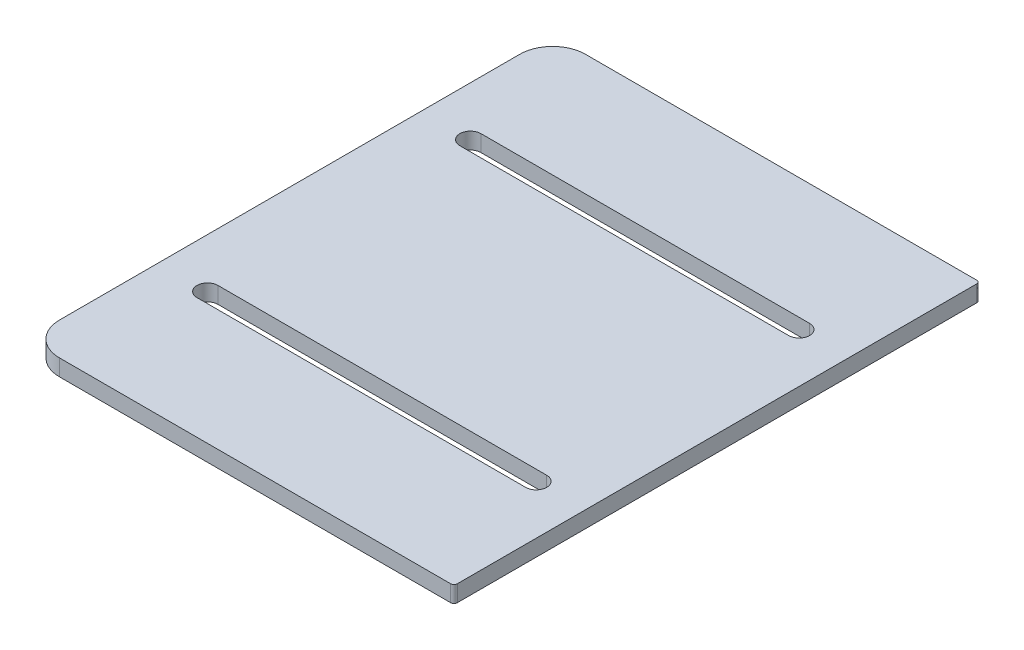
ISO-10303-21;
HEADER;
FILE_DESCRIPTION(('STEP AP214'),'2;1');
FILE_NAME('part.step','',(''),(''),'','','');
FILE_SCHEMA(('AUTOMOTIVE_DESIGN { 1 0 10303 214 1 1 1 1 }'));
ENDSEC;
DATA;
#1=APPLICATION_CONTEXT('core data for automotive mechanical design processes');
#2=APPLICATION_PROTOCOL_DEFINITION('international standard','automotive_design',2000,#1);
#3=PRODUCT_CONTEXT('',#1,'mechanical');
#4=PRODUCT('Part','Part','',(#3));
#5=PRODUCT_RELATED_PRODUCT_CATEGORY('part','',(#4));
#6=PRODUCT_DEFINITION_FORMATION('','',#4);
#7=PRODUCT_DEFINITION_CONTEXT('part definition',#1,'design');
#8=PRODUCT_DEFINITION('design','',#6,#7);
#9=PRODUCT_DEFINITION_SHAPE('','',#8);
#10=(LENGTH_UNIT() NAMED_UNIT(*) SI_UNIT(.MILLI.,.METRE.));
#11=(NAMED_UNIT(*) PLANE_ANGLE_UNIT() SI_UNIT($,.RADIAN.));
#12=(NAMED_UNIT(*) SI_UNIT($,.STERADIAN.) SOLID_ANGLE_UNIT());
#13=UNCERTAINTY_MEASURE_WITH_UNIT(LENGTH_MEASURE(1.E-05),#10,'distance_accuracy_value','');
#14=(GEOMETRIC_REPRESENTATION_CONTEXT(3) GLOBAL_UNCERTAINTY_ASSIGNED_CONTEXT((#13)) GLOBAL_UNIT_ASSIGNED_CONTEXT((#10,
#11,#12)) REPRESENTATION_CONTEXT('',''));
#15=CARTESIAN_POINT('',(0.,0.,0.));
#16=DIRECTION('',(0.,0.,1.));
#17=DIRECTION('',(1.,0.,0.));
#18=AXIS2_PLACEMENT_3D('',#15,#16,#17);
#19=CARTESIAN_POINT('',(0.,6.35,46.7359999999999));
#20=DIRECTION('',(0.,0.,-1.));
#21=DIRECTION('',(-1.,0.,0.));
#22=AXIS2_PLACEMENT_3D('',#19,#20,#21);
#23=PLANE('',#22);
#24=DIRECTION('',(1.,0.,0.));
#25=VECTOR('',#24,1.);
#26=CARTESIAN_POINT('',(0.,0.,46.7359999999999));
#27=LINE('',#26,#25);
#28=CARTESIAN_POINT('',(-63.5000000000001,0.,46.7359999999999));
#29=VERTEX_POINT('',#28);
#30=CARTESIAN_POINT('',(63.4999999999999,0.,46.7359999999999));
#31=VERTEX_POINT('',#30);
#32=EDGE_CURVE('E312',#29,#31,#27,.T.);
#33=ORIENTED_EDGE('',*,*,#32,.T.);
#34=DIRECTION('',(0.,-1.,0.));
#35=VECTOR('',#34,1.);
#36=CARTESIAN_POINT('',(63.4999999999999,6.35,46.7359999999999));
#37=LINE('',#36,#35);
#38=CARTESIAN_POINT('',(63.4999999999999,6.35,46.7359999999999));
#39=VERTEX_POINT('',#38);
#40=EDGE_CURVE('E326',#39,#31,#37,.T.);
#41=ORIENTED_EDGE('',*,*,#40,.F.);
#42=DIRECTION('',(1.,0.,0.));
#43=VECTOR('',#42,1.);
#44=CARTESIAN_POINT('',(0.,6.35,46.7359999999999));
#45=LINE('',#44,#43);
#46=CARTESIAN_POINT('',(-63.5000000000001,6.35,46.7359999999999));
#47=VERTEX_POINT('',#46);
#48=EDGE_CURVE('E232',#47,#39,#45,.T.);
#49=ORIENTED_EDGE('',*,*,#48,.F.);
#50=DIRECTION('',(0.,-1.,0.));
#51=VECTOR('',#50,1.);
#52=CARTESIAN_POINT('',(-63.5000000000001,6.35,46.7359999999999));
#53=LINE('',#52,#51);
#54=EDGE_CURVE('E168',#47,#29,#53,.T.);
#55=ORIENTED_EDGE('',*,*,#54,.T.);
#56=EDGE_LOOP('',(#33,#41,#49,#55));
#57=FACE_BOUND('',#56,.T.);
#58=ADVANCED_FACE('F40',(#57),#23,.F.);
#59=CARTESIAN_POINT('',(63.4999999999999,6.35,50.7999999999999));
#60=DIRECTION('',(0.,-1.,0.));
#61=DIRECTION('',(0.,0.,-1.));
#62=AXIS2_PLACEMENT_3D('',#59,#60,#61);
#63=CYLINDRICAL_SURFACE('',#62,4.06400000000001);
#64=CARTESIAN_POINT('',(63.4999999999999,0.,50.7999999999999));
#65=DIRECTION('',(0.,1.,0.));
#66=DIRECTION('',(0.,0.,1.));
#67=AXIS2_PLACEMENT_3D('',#64,#65,#66);
#68=CIRCLE('',#67,4.06400000000001);
#69=CARTESIAN_POINT('',(63.4999999999999,0.,54.8639999999999));
#70=VERTEX_POINT('',#69);
#71=EDGE_CURVE('E315',#31,#70,#68,.F.);
#72=ORIENTED_EDGE('',*,*,#71,.T.);
#73=DIRECTION('',(0.,-1.,0.));
#74=VECTOR('',#73,1.);
#75=CARTESIAN_POINT('',(63.4999999999999,6.35,54.8639999999999));
#76=LINE('',#75,#74);
#77=CARTESIAN_POINT('',(63.4999999999999,6.35,54.8639999999999));
#78=VERTEX_POINT('',#77);
#79=EDGE_CURVE('E324',#78,#70,#76,.T.);
#80=ORIENTED_EDGE('',*,*,#79,.F.);
#81=CARTESIAN_POINT('',(63.4999999999999,6.35,50.7999999999999));
#82=DIRECTION('',(0.,1.,0.));
#83=DIRECTION('',(0.,0.,1.));
#84=AXIS2_PLACEMENT_3D('',#81,#82,#83);
#85=CIRCLE('',#84,4.06400000000001);
#86=EDGE_CURVE('E282',#39,#78,#85,.F.);
#87=ORIENTED_EDGE('',*,*,#86,.F.);
#88=ORIENTED_EDGE('',*,*,#40,.T.);
#89=EDGE_LOOP('',(#72,#80,#87,#88));
#90=FACE_BOUND('',#89,.T.);
#91=ADVANCED_FACE('F363',(#90),#63,.F.);
#92=CARTESIAN_POINT('',(0.,6.35,54.8639999999999));
#93=DIRECTION('',(0.,0.,-1.));
#94=DIRECTION('',(-1.,0.,0.));
#95=AXIS2_PLACEMENT_3D('',#92,#93,#94);
#96=PLANE('',#95);
#97=DIRECTION('',(1.,0.,0.));
#98=VECTOR('',#97,1.);
#99=CARTESIAN_POINT('',(0.,0.,54.8639999999999));
#100=LINE('',#99,#98);
#101=CARTESIAN_POINT('',(-63.5000000000001,0.,54.864));
#102=VERTEX_POINT('',#101);
#103=EDGE_CURVE('E186',#102,#70,#100,.T.);
#104=ORIENTED_EDGE('',*,*,#103,.F.);
#105=DIRECTION('',(0.,-1.,0.));
#106=VECTOR('',#105,1.);
#107=CARTESIAN_POINT('',(-63.5000000000001,6.35,54.864));
#108=LINE('',#107,#106);
#109=CARTESIAN_POINT('',(-63.5000000000001,6.35,54.864));
#110=VERTEX_POINT('',#109);
#111=EDGE_CURVE('E322',#110,#102,#108,.T.);
#112=ORIENTED_EDGE('',*,*,#111,.F.);
#113=DIRECTION('',(1.,0.,0.));
#114=VECTOR('',#113,1.);
#115=CARTESIAN_POINT('',(0.,6.35,54.8639999999999));
#116=LINE('',#115,#114);
#117=EDGE_CURVE('E284',#110,#78,#116,.T.);
#118=ORIENTED_EDGE('',*,*,#117,.T.);
#119=ORIENTED_EDGE('',*,*,#79,.T.);
#120=EDGE_LOOP('',(#104,#112,#118,#119));
#121=FACE_BOUND('',#120,.T.);
#122=ADVANCED_FACE('F369',(#121),#96,.T.);
#123=CARTESIAN_POINT('',(0.,6.35,101.6));
#124=DIRECTION('',(0.,0.,-1.));
#125=DIRECTION('',(-1.,0.,0.));
#126=AXIS2_PLACEMENT_3D('',#123,#124,#125);
#127=PLANE('',#126);
#128=DIRECTION('',(1.,0.,0.));
#129=VECTOR('',#128,1.);
#130=CARTESIAN_POINT('',(0.,0.,101.6));
#131=LINE('',#130,#129);
#132=CARTESIAN_POINT('',(-69.85,0.,101.6));
#133=VERTEX_POINT('',#132);
#134=CARTESIAN_POINT('',(81.28,0.,101.6));
#135=VERTEX_POINT('',#134);
#136=EDGE_CURVE('E262',#133,#135,#131,.T.);
#137=ORIENTED_EDGE('',*,*,#136,.T.);
#138=DIRECTION('',(0.,-1.,0.));
#139=VECTOR('',#138,1.);
#140=CARTESIAN_POINT('',(81.28,6.35,101.6));
#141=LINE('',#140,#139);
#142=CARTESIAN_POINT('',(81.28,6.35,101.6));
#143=VERTEX_POINT('',#142);
#144=EDGE_CURVE('E63',#135,#143,#141,.F.);
#145=ORIENTED_EDGE('',*,*,#144,.T.);
#146=DIRECTION('',(1.,0.,0.));
#147=VECTOR('',#146,1.);
#148=CARTESIAN_POINT('',(0.,6.35,101.6));
#149=LINE('',#148,#147);
#150=CARTESIAN_POINT('',(-69.85,6.35,101.6));
#151=VERTEX_POINT('',#150);
#152=EDGE_CURVE('E202',#151,#143,#149,.T.);
#153=ORIENTED_EDGE('',*,*,#152,.F.);
#154=DIRECTION('',(0.,-1.,0.));
#155=VECTOR('',#154,1.);
#156=CARTESIAN_POINT('',(-69.85,0.,101.6));
#157=LINE('',#156,#155);
#158=EDGE_CURVE('E247',#151,#133,#157,.T.);
#159=ORIENTED_EDGE('',*,*,#158,.T.);
#160=EDGE_LOOP('',(#137,#145,#153,#159));
#161=FACE_BOUND('',#160,.T.);
#162=ADVANCED_FACE('F267',(#161),#127,.F.);
#163=CARTESIAN_POINT('',(82.55,6.35,0.));
#164=DIRECTION('',(-1.,0.,0.));
#165=DIRECTION('',(0.,0.,1.));
#166=AXIS2_PLACEMENT_3D('',#163,#164,#165);
#167=PLANE('',#166);
#168=DIRECTION('',(0.,0.,-1.));
#169=VECTOR('',#168,1.);
#170=CARTESIAN_POINT('',(82.55,6.35,0.));
#171=LINE('',#170,#169);
#172=CARTESIAN_POINT('',(82.55,6.35,100.33));
#173=VERTEX_POINT('',#172);
#174=CARTESIAN_POINT('',(82.55,6.35,-100.33));
#175=VERTEX_POINT('',#174);
#176=EDGE_CURVE('E206',#173,#175,#171,.T.);
#177=ORIENTED_EDGE('',*,*,#176,.F.);
#178=DIRECTION('',(0.,-1.,0.));
#179=VECTOR('',#178,1.);
#180=CARTESIAN_POINT('',(82.55,6.35,100.33));
#181=LINE('',#180,#179);
#182=CARTESIAN_POINT('',(82.55,0.,100.33));
#183=VERTEX_POINT('',#182);
#184=EDGE_CURVE('E252',#173,#183,#181,.T.);
#185=ORIENTED_EDGE('',*,*,#184,.T.);
#186=DIRECTION('',(0.,0.,-1.));
#187=VECTOR('',#186,1.);
#188=CARTESIAN_POINT('',(82.55,0.,0.));
#189=LINE('',#188,#187);
#190=CARTESIAN_POINT('',(82.55,0.,-100.33));
#191=VERTEX_POINT('',#190);
#192=EDGE_CURVE('E264',#183,#191,#189,.T.);
#193=ORIENTED_EDGE('',*,*,#192,.T.);
#194=DIRECTION('',(0.,-1.,0.));
#195=VECTOR('',#194,1.);
#196=CARTESIAN_POINT('',(82.55,6.35,-100.33));
#197=LINE('',#196,#195);
#198=EDGE_CURVE('E250',#191,#175,#197,.F.);
#199=ORIENTED_EDGE('',*,*,#198,.T.);
#200=EDGE_LOOP('',(#177,#185,#193,#199));
#201=FACE_BOUND('',#200,.T.);
#202=ADVANCED_FACE('F276',(#201),#167,.F.);
#203=CARTESIAN_POINT('',(0.,6.35,-101.6));
#204=DIRECTION('',(0.,0.,-1.));
#205=DIRECTION('',(-1.,0.,0.));
#206=AXIS2_PLACEMENT_3D('',#203,#204,#205);
#207=PLANE('',#206);
#208=DIRECTION('',(1.,0.,0.));
#209=VECTOR('',#208,1.);
#210=CARTESIAN_POINT('',(0.,6.35,-101.6));
#211=LINE('',#210,#209);
#212=CARTESIAN_POINT('',(-69.85,6.35,-101.6));
#213=VERTEX_POINT('',#212);
#214=CARTESIAN_POINT('',(81.28,6.35,-101.6));
#215=VERTEX_POINT('',#214);
#216=EDGE_CURVE('E223',#213,#215,#211,.T.);
#217=ORIENTED_EDGE('',*,*,#216,.T.);
#218=DIRECTION('',(0.,-1.,0.));
#219=VECTOR('',#218,1.);
#220=CARTESIAN_POINT('',(81.28,0.,-101.6));
#221=LINE('',#220,#219);
#222=CARTESIAN_POINT('',(81.28,0.,-101.6));
#223=VERTEX_POINT('',#222);
#224=EDGE_CURVE('E12',#215,#223,#221,.T.);
#225=ORIENTED_EDGE('',*,*,#224,.T.);
#226=DIRECTION('',(1.,0.,0.));
#227=VECTOR('',#226,1.);
#228=CARTESIAN_POINT('',(0.,0.,-101.6));
#229=LINE('',#228,#227);
#230=CARTESIAN_POINT('',(-69.85,0.,-101.6));
#231=VERTEX_POINT('',#230);
#232=EDGE_CURVE('E306',#231,#223,#229,.T.);
#233=ORIENTED_EDGE('',*,*,#232,.F.);
#234=DIRECTION('',(0.,-1.,0.));
#235=VECTOR('',#234,1.);
#236=CARTESIAN_POINT('',(-69.85,6.35,-101.6));
#237=LINE('',#236,#235);
#238=EDGE_CURVE('E242',#231,#213,#237,.F.);
#239=ORIENTED_EDGE('',*,*,#238,.T.);
#240=EDGE_LOOP('',(#217,#225,#233,#239));
#241=FACE_BOUND('',#240,.T.);
#242=ADVANCED_FACE('F341',(#241),#207,.T.);
#243=CARTESIAN_POINT('',(-63.5000000000001,6.35,-50.8000000000001));
#244=DIRECTION('',(0.,-1.,0.));
#245=DIRECTION('',(0.,0.,-1.));
#246=AXIS2_PLACEMENT_3D('',#243,#244,#245);
#247=CYLINDRICAL_SURFACE('',#246,4.06400000000001);
#248=CARTESIAN_POINT('',(-63.5000000000001,0.,-50.8000000000001));
#249=DIRECTION('',(0.,1.,0.));
#250=DIRECTION('',(0.,0.,1.));
#251=AXIS2_PLACEMENT_3D('',#248,#249,#250);
#252=CIRCLE('',#251,4.06400000000001);
#253=CARTESIAN_POINT('',(-63.5000000000001,0.,-54.8640000000001));
#254=VERTEX_POINT('',#253);
#255=CARTESIAN_POINT('',(-63.5000000000001,0.,-46.736));
#256=VERTEX_POINT('',#255);
#257=EDGE_CURVE('E164',#254,#256,#252,.T.);
#258=ORIENTED_EDGE('',*,*,#257,.F.);
#259=DIRECTION('',(0.,-1.,0.));
#260=VECTOR('',#259,1.);
#261=CARTESIAN_POINT('',(-63.5000000000001,6.35,-54.8640000000001));
#262=LINE('',#261,#260);
#263=CARTESIAN_POINT('',(-63.5000000000001,6.35,-54.8640000000001));
#264=VERTEX_POINT('',#263);
#265=EDGE_CURVE('E157',#264,#254,#262,.T.);
#266=ORIENTED_EDGE('',*,*,#265,.F.);
#267=CARTESIAN_POINT('',(-63.5000000000001,6.35,-50.8000000000001));
#268=DIRECTION('',(0.,1.,0.));
#269=DIRECTION('',(0.,0.,1.));
#270=AXIS2_PLACEMENT_3D('',#267,#268,#269);
#271=CIRCLE('',#270,4.06400000000001);
#272=CARTESIAN_POINT('',(-63.5000000000001,6.35,-46.736));
#273=VERTEX_POINT('',#272);
#274=EDGE_CURVE('E161',#264,#273,#271,.T.);
#275=ORIENTED_EDGE('',*,*,#274,.T.);
#276=DIRECTION('',(0.,-1.,0.));
#277=VECTOR('',#276,1.);
#278=CARTESIAN_POINT('',(-63.5000000000001,6.35,-46.736));
#279=LINE('',#278,#277);
#280=EDGE_CURVE('E288',#273,#256,#279,.T.);
#281=ORIENTED_EDGE('',*,*,#280,.T.);
#282=EDGE_LOOP('',(#258,#266,#275,#281));
#283=FACE_BOUND('',#282,.T.);
#284=ADVANCED_FACE('F159',(#283),#247,.F.);
#285=CARTESIAN_POINT('',(0.,6.35,-54.8640000000001));
#286=DIRECTION('',(0.,0.,-1.));
#287=DIRECTION('',(-1.,0.,0.));
#288=AXIS2_PLACEMENT_3D('',#285,#286,#287);
#289=PLANE('',#288);
#290=DIRECTION('',(1.,0.,0.));
#291=VECTOR('',#290,1.);
#292=CARTESIAN_POINT('',(0.,0.,-54.8640000000001));
#293=LINE('',#292,#291);
#294=CARTESIAN_POINT('',(63.4999999999999,0.,-54.8640000000001));
#295=VERTEX_POINT('',#294);
#296=EDGE_CURVE('E298',#254,#295,#293,.T.);
#297=ORIENTED_EDGE('',*,*,#296,.T.);
#298=DIRECTION('',(0.,-1.,0.));
#299=VECTOR('',#298,1.);
#300=CARTESIAN_POINT('',(63.4999999999999,6.35,-54.8640000000001));
#301=LINE('',#300,#299);
#302=CARTESIAN_POINT('',(63.4999999999999,6.35,-54.8640000000001));
#303=VERTEX_POINT('',#302);
#304=EDGE_CURVE('E169',#303,#295,#301,.T.);
#305=ORIENTED_EDGE('',*,*,#304,.F.);
#306=DIRECTION('',(1.,0.,0.));
#307=VECTOR('',#306,1.);
#308=CARTESIAN_POINT('',(0.,6.35,-54.8640000000001));
#309=LINE('',#308,#307);
#310=EDGE_CURVE('E172',#264,#303,#309,.T.);
#311=ORIENTED_EDGE('',*,*,#310,.F.);
#312=ORIENTED_EDGE('',*,*,#265,.T.);
#313=EDGE_LOOP('',(#297,#305,#311,#312));
#314=FACE_BOUND('',#313,.T.);
#315=ADVANCED_FACE('F173',(#314),#289,.F.);
#316=CARTESIAN_POINT('',(63.4999999999999,6.35,-50.8000000000001));
#317=DIRECTION('',(0.,-1.,0.));
#318=DIRECTION('',(0.,0.,-1.));
#319=AXIS2_PLACEMENT_3D('',#316,#317,#318);
#320=CYLINDRICAL_SURFACE('',#319,4.06400000000001);
#321=CARTESIAN_POINT('',(63.4999999999999,0.,-50.8000000000001));
#322=DIRECTION('',(0.,1.,0.));
#323=DIRECTION('',(0.,0.,1.));
#324=AXIS2_PLACEMENT_3D('',#321,#322,#323);
#325=CIRCLE('',#324,4.06400000000001);
#326=CARTESIAN_POINT('',(63.4999999999999,0.,-46.7360000000001));
#327=VERTEX_POINT('',#326);
#328=EDGE_CURVE('E300',#327,#295,#325,.T.);
#329=ORIENTED_EDGE('',*,*,#328,.F.);
#330=DIRECTION('',(0.,-1.,0.));
#331=VECTOR('',#330,1.);
#332=CARTESIAN_POINT('',(63.4999999999999,6.35,-46.7360000000001));
#333=LINE('',#332,#331);
#334=CARTESIAN_POINT('',(63.4999999999999,6.35,-46.7360000000001));
#335=VERTEX_POINT('',#334);
#336=EDGE_CURVE('E293',#335,#327,#333,.T.);
#337=ORIENTED_EDGE('',*,*,#336,.F.);
#338=CARTESIAN_POINT('',(63.4999999999999,6.35,-50.8000000000001));
#339=DIRECTION('',(0.,1.,0.));
#340=DIRECTION('',(0.,0.,1.));
#341=AXIS2_PLACEMENT_3D('',#338,#339,#340);
#342=CIRCLE('',#341,4.06400000000001);
#343=EDGE_CURVE('E178',#335,#303,#342,.T.);
#344=ORIENTED_EDGE('',*,*,#343,.T.);
#345=ORIENTED_EDGE('',*,*,#304,.T.);
#346=EDGE_LOOP('',(#329,#337,#344,#345));
#347=FACE_BOUND('',#346,.T.);
#348=ADVANCED_FACE('F377',(#347),#320,.F.);
#349=CARTESIAN_POINT('',(-82.55,6.35,0.));
#350=DIRECTION('',(-1.,0.,0.));
#351=DIRECTION('',(0.,0.,1.));
#352=AXIS2_PLACEMENT_3D('',#349,#350,#351);
#353=PLANE('',#352);
#354=DIRECTION('',(0.,0.,-1.));
#355=VECTOR('',#354,1.);
#356=CARTESIAN_POINT('',(-82.55,6.35,0.));
#357=LINE('',#356,#355);
#358=CARTESIAN_POINT('',(-82.55,6.35,88.9));
#359=VERTEX_POINT('',#358);
#360=CARTESIAN_POINT('',(-82.55,6.35,-88.9));
#361=VERTEX_POINT('',#360);
#362=EDGE_CURVE('E227',#359,#361,#357,.T.);
#363=ORIENTED_EDGE('',*,*,#362,.T.);
#364=DIRECTION('',(0.,-1.,0.));
#365=VECTOR('',#364,1.);
#366=CARTESIAN_POINT('',(-82.55,6.35,-88.9));
#367=LINE('',#366,#365);
#368=CARTESIAN_POINT('',(-82.55,0.,-88.9));
#369=VERTEX_POINT('',#368);
#370=EDGE_CURVE('E333',#361,#369,#367,.T.);
#371=ORIENTED_EDGE('',*,*,#370,.T.);
#372=DIRECTION('',(0.,0.,-1.));
#373=VECTOR('',#372,1.);
#374=CARTESIAN_POINT('',(-82.55,0.,0.));
#375=LINE('',#374,#373);
#376=CARTESIAN_POINT('',(-82.55,0.,88.9));
#377=VERTEX_POINT('',#376);
#378=EDGE_CURVE('E309',#377,#369,#375,.T.);
#379=ORIENTED_EDGE('',*,*,#378,.F.);
#380=DIRECTION('',(0.,-1.,0.));
#381=VECTOR('',#380,1.);
#382=CARTESIAN_POINT('',(-82.55,6.35,88.9));
#383=LINE('',#382,#381);
#384=EDGE_CURVE('E328',#377,#359,#383,.F.);
#385=ORIENTED_EDGE('',*,*,#384,.T.);
#386=EDGE_LOOP('',(#363,#371,#379,#385));
#387=FACE_BOUND('',#386,.T.);
#388=ADVANCED_FACE('F350',(#387),#353,.T.);
#389=CARTESIAN_POINT('',(0.,6.35,-46.736));
#390=DIRECTION('',(0.,0.,-1.));
#391=DIRECTION('',(-1.,0.,0.));
#392=AXIS2_PLACEMENT_3D('',#389,#390,#391);
#393=PLANE('',#392);
#394=DIRECTION('',(1.,0.,0.));
#395=VECTOR('',#394,1.);
#396=CARTESIAN_POINT('',(0.,0.,-46.736));
#397=LINE('',#396,#395);
#398=EDGE_CURVE('E269',#256,#327,#397,.T.);
#399=ORIENTED_EDGE('',*,*,#398,.F.);
#400=ORIENTED_EDGE('',*,*,#280,.F.);
#401=DIRECTION('',(1.,0.,0.));
#402=VECTOR('',#401,1.);
#403=CARTESIAN_POINT('',(0.,6.35,-46.736));
#404=LINE('',#403,#402);
#405=EDGE_CURVE('E182',#273,#335,#404,.T.);
#406=ORIENTED_EDGE('',*,*,#405,.T.);
#407=ORIENTED_EDGE('',*,*,#336,.T.);
#408=EDGE_LOOP('',(#399,#400,#406,#407));
#409=FACE_BOUND('',#408,.T.);
#410=ADVANCED_FACE('F376',(#409),#393,.T.);
#411=CARTESIAN_POINT('',(-63.5000000000001,6.35,50.7999999999999));
#412=DIRECTION('',(0.,-1.,0.));
#413=DIRECTION('',(0.,0.,-1.));
#414=AXIS2_PLACEMENT_3D('',#411,#412,#413);
#415=CYLINDRICAL_SURFACE('',#414,4.06400000000001);
#416=CARTESIAN_POINT('',(-63.5000000000001,0.,50.7999999999999));
#417=DIRECTION('',(0.,1.,0.));
#418=DIRECTION('',(0.,0.,1.));
#419=AXIS2_PLACEMENT_3D('',#416,#417,#418);
#420=CIRCLE('',#419,4.06400000000001);
#421=EDGE_CURVE('E184',#102,#29,#420,.F.);
#422=ORIENTED_EDGE('',*,*,#421,.T.);
#423=ORIENTED_EDGE('',*,*,#54,.F.);
#424=CARTESIAN_POINT('',(-63.5000000000001,6.35,50.7999999999999));
#425=DIRECTION('',(0.,1.,0.));
#426=DIRECTION('',(0.,0.,1.));
#427=AXIS2_PLACEMENT_3D('',#424,#425,#426);
#428=CIRCLE('',#427,4.06400000000001);
#429=EDGE_CURVE('E287',#110,#47,#428,.F.);
#430=ORIENTED_EDGE('',*,*,#429,.F.);
#431=ORIENTED_EDGE('',*,*,#111,.T.);
#432=EDGE_LOOP('',(#422,#423,#430,#431));
#433=FACE_BOUND('',#432,.T.);
#434=ADVANCED_FACE('F386',(#433),#415,.F.);
#435=CARTESIAN_POINT('',(0.,6.35,0.));
#436=DIRECTION('',(0.,1.,0.));
#437=DIRECTION('',(0.,0.,1.));
#438=AXIS2_PLACEMENT_3D('',#435,#436,#437);
#439=PLANE('',#438);
#440=ORIENTED_EDGE('',*,*,#274,.F.);
#441=ORIENTED_EDGE('',*,*,#310,.T.);
#442=ORIENTED_EDGE('',*,*,#343,.F.);
#443=ORIENTED_EDGE('',*,*,#405,.F.);
#444=EDGE_LOOP('',(#440,#441,#442,#443));
#445=FACE_BOUND('',#444,.T.);
#446=ORIENTED_EDGE('',*,*,#152,.T.);
#447=CARTESIAN_POINT('',(81.28,6.35,100.33));
#448=DIRECTION('',(0.,1.,0.));
#449=DIRECTION('',(0.,0.,1.));
#450=AXIS2_PLACEMENT_3D('',#447,#448,#449);
#451=CIRCLE('',#450,1.27);
#452=EDGE_CURVE('E48',#143,#173,#451,.T.);
#453=ORIENTED_EDGE('',*,*,#452,.T.);
#454=ORIENTED_EDGE('',*,*,#176,.T.);
#455=CARTESIAN_POINT('',(81.28,6.35,-100.33));
#456=DIRECTION('',(0.,1.,0.));
#457=DIRECTION('',(0.,0.,1.));
#458=AXIS2_PLACEMENT_3D('',#455,#456,#457);
#459=CIRCLE('',#458,1.27);
#460=EDGE_CURVE('E55',#175,#215,#459,.T.);
#461=ORIENTED_EDGE('',*,*,#460,.T.);
#462=ORIENTED_EDGE('',*,*,#216,.F.);
#463=CARTESIAN_POINT('',(-69.85,6.35,-88.9));
#464=DIRECTION('',(0.,1.,0.));
#465=DIRECTION('',(0.,0.,1.));
#466=AXIS2_PLACEMENT_3D('',#463,#464,#465);
#467=CIRCLE('',#466,12.7);
#468=EDGE_CURVE('E241',#213,#361,#467,.T.);
#469=ORIENTED_EDGE('',*,*,#468,.T.);
#470=ORIENTED_EDGE('',*,*,#362,.F.);
#471=CARTESIAN_POINT('',(-69.85,6.35,88.9));
#472=DIRECTION('',(0.,1.,0.));
#473=DIRECTION('',(0.,0.,1.));
#474=AXIS2_PLACEMENT_3D('',#471,#472,#473);
#475=CIRCLE('',#474,12.7);
#476=EDGE_CURVE('E237',#359,#151,#475,.T.);
#477=ORIENTED_EDGE('',*,*,#476,.T.);
#478=EDGE_LOOP('',(#446,#453,#454,#461,#462,#469,#470,#477));
#479=FACE_BOUND('',#478,.T.);
#480=ORIENTED_EDGE('',*,*,#48,.T.);
#481=ORIENTED_EDGE('',*,*,#86,.T.);
#482=ORIENTED_EDGE('',*,*,#117,.F.);
#483=ORIENTED_EDGE('',*,*,#429,.T.);
#484=EDGE_LOOP('',(#480,#481,#482,#483));
#485=FACE_BOUND('',#484,.T.);
#486=ADVANCED_FACE('F180',(#445,#479,#485),#439,.T.);
#487=CARTESIAN_POINT('',(0.,0.,0.));
#488=DIRECTION('',(0.,1.,0.));
#489=DIRECTION('',(0.,0.,1.));
#490=AXIS2_PLACEMENT_3D('',#487,#488,#489);
#491=PLANE('',#490);
#492=ORIENTED_EDGE('',*,*,#257,.T.);
#493=ORIENTED_EDGE('',*,*,#398,.T.);
#494=ORIENTED_EDGE('',*,*,#328,.T.);
#495=ORIENTED_EDGE('',*,*,#296,.F.);
#496=EDGE_LOOP('',(#492,#493,#494,#495));
#497=FACE_BOUND('',#496,.T.);
#498=ORIENTED_EDGE('',*,*,#192,.F.);
#499=CARTESIAN_POINT('',(81.28,0.,100.33));
#500=DIRECTION('',(0.,1.,0.));
#501=DIRECTION('',(0.,0.,1.));
#502=AXIS2_PLACEMENT_3D('',#499,#500,#501);
#503=CIRCLE('',#502,1.27);
#504=EDGE_CURVE('E256',#183,#135,#503,.F.);
#505=ORIENTED_EDGE('',*,*,#504,.T.);
#506=ORIENTED_EDGE('',*,*,#136,.F.);
#507=CARTESIAN_POINT('',(-69.85,0.,88.9));
#508=DIRECTION('',(0.,1.,0.));
#509=DIRECTION('',(0.,0.,1.));
#510=AXIS2_PLACEMENT_3D('',#507,#508,#509);
#511=CIRCLE('',#510,12.7);
#512=EDGE_CURVE('E336',#133,#377,#511,.F.);
#513=ORIENTED_EDGE('',*,*,#512,.T.);
#514=ORIENTED_EDGE('',*,*,#378,.T.);
#515=CARTESIAN_POINT('',(-69.85,0.,-88.9));
#516=DIRECTION('',(0.,1.,0.));
#517=DIRECTION('',(0.,0.,1.));
#518=AXIS2_PLACEMENT_3D('',#515,#516,#517);
#519=CIRCLE('',#518,12.7);
#520=EDGE_CURVE('E337',#369,#231,#519,.F.);
#521=ORIENTED_EDGE('',*,*,#520,.T.);
#522=ORIENTED_EDGE('',*,*,#232,.T.);
#523=CARTESIAN_POINT('',(81.28,0.,-100.33));
#524=DIRECTION('',(0.,1.,0.));
#525=DIRECTION('',(0.,0.,1.));
#526=AXIS2_PLACEMENT_3D('',#523,#524,#525);
#527=CIRCLE('',#526,1.27);
#528=EDGE_CURVE('E255',#223,#191,#527,.F.);
#529=ORIENTED_EDGE('',*,*,#528,.T.);
#530=EDGE_LOOP('',(#498,#505,#506,#513,#514,#521,#522,#529));
#531=FACE_BOUND('',#530,.T.);
#532=ORIENTED_EDGE('',*,*,#32,.F.);
#533=ORIENTED_EDGE('',*,*,#421,.F.);
#534=ORIENTED_EDGE('',*,*,#103,.T.);
#535=ORIENTED_EDGE('',*,*,#71,.F.);
#536=EDGE_LOOP('',(#532,#533,#534,#535));
#537=FACE_BOUND('',#536,.T.);
#538=ADVANCED_FACE('F260',(#497,#531,#537),#491,.F.);
#539=CARTESIAN_POINT('',(-69.85,6.35,-88.9));
#540=DIRECTION('',(0.,-1.,0.));
#541=DIRECTION('',(0.,0.,-1.));
#542=AXIS2_PLACEMENT_3D('',#539,#540,#541);
#543=CYLINDRICAL_SURFACE('',#542,12.7);
#544=ORIENTED_EDGE('',*,*,#468,.F.);
#545=ORIENTED_EDGE('',*,*,#238,.F.);
#546=ORIENTED_EDGE('',*,*,#520,.F.);
#547=ORIENTED_EDGE('',*,*,#370,.F.);
#548=EDGE_LOOP('',(#544,#545,#546,#547));
#549=FACE_BOUND('',#548,.T.);
#550=ADVANCED_FACE('F347',(#549),#543,.T.);
#551=CARTESIAN_POINT('',(-69.85,6.35,88.9));
#552=DIRECTION('',(0.,1.,0.));
#553=DIRECTION('',(0.,0.,1.));
#554=AXIS2_PLACEMENT_3D('',#551,#552,#553);
#555=CYLINDRICAL_SURFACE('',#554,12.7);
#556=ORIENTED_EDGE('',*,*,#476,.F.);
#557=ORIENTED_EDGE('',*,*,#384,.F.);
#558=ORIENTED_EDGE('',*,*,#512,.F.);
#559=ORIENTED_EDGE('',*,*,#158,.F.);
#560=EDGE_LOOP('',(#556,#557,#558,#559));
#561=FACE_BOUND('',#560,.T.);
#562=ADVANCED_FACE('F354',(#561),#555,.T.);
#563=CARTESIAN_POINT('',(81.28,6.35,100.33));
#564=DIRECTION('',(0.,-1.,0.));
#565=DIRECTION('',(0.,0.,-1.));
#566=AXIS2_PLACEMENT_3D('',#563,#564,#565);
#567=CYLINDRICAL_SURFACE('',#566,1.27);
#568=ORIENTED_EDGE('',*,*,#452,.F.);
#569=ORIENTED_EDGE('',*,*,#144,.F.);
#570=ORIENTED_EDGE('',*,*,#504,.F.);
#571=ORIENTED_EDGE('',*,*,#184,.F.);
#572=EDGE_LOOP('',(#568,#569,#570,#571));
#573=FACE_BOUND('',#572,.T.);
#574=ADVANCED_FACE('F272',(#573),#567,.T.);
#575=CARTESIAN_POINT('',(81.28,6.35,-100.33));
#576=DIRECTION('',(0.,1.,0.));
#577=DIRECTION('',(0.,0.,1.));
#578=AXIS2_PLACEMENT_3D('',#575,#576,#577);
#579=CYLINDRICAL_SURFACE('',#578,1.27);
#580=ORIENTED_EDGE('',*,*,#460,.F.);
#581=ORIENTED_EDGE('',*,*,#198,.F.);
#582=ORIENTED_EDGE('',*,*,#528,.F.);
#583=ORIENTED_EDGE('',*,*,#224,.F.);
#584=EDGE_LOOP('',(#580,#581,#582,#583));
#585=FACE_BOUND('',#584,.T.);
#586=ADVANCED_FACE('F42',(#585),#579,.T.);
#587=CLOSED_SHELL('',(#58,#91,#122,#162,#202,#242,#284,#315,#348,#388,#410,#434,#486,#538,#550,
#562,#574,#586));
#588=MANIFOLD_SOLID_BREP('B2',#587);
#589=ADVANCED_BREP_SHAPE_REPRESENTATION('',(#18,#588),#14);
#590=SHAPE_DEFINITION_REPRESENTATION(#9,#589);
ENDSEC;
END-ISO-10303-21;
